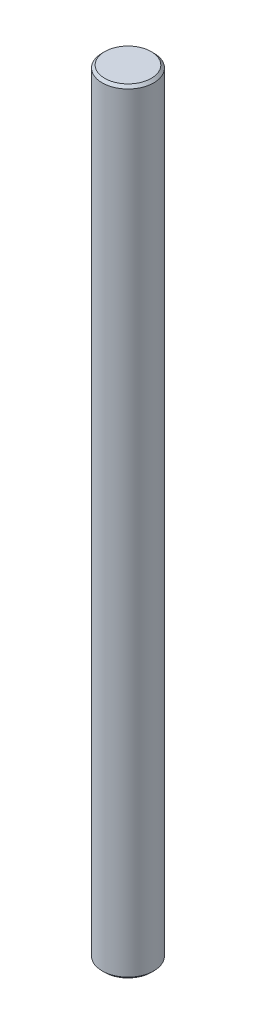
ISO-10303-21;
HEADER;
FILE_DESCRIPTION(('STEP AP214'),'2;1');
FILE_NAME('part.step','',(''),(''),'','','');
FILE_SCHEMA(('AUTOMOTIVE_DESIGN { 1 0 10303 214 1 1 1 1 }'));
ENDSEC;
DATA;
#1=APPLICATION_CONTEXT('core data for automotive mechanical design processes');
#2=APPLICATION_PROTOCOL_DEFINITION('international standard','automotive_design',2000,#1);
#3=PRODUCT_CONTEXT('',#1,'mechanical');
#4=PRODUCT('Part','Part','',(#3));
#5=PRODUCT_RELATED_PRODUCT_CATEGORY('part','',(#4));
#6=PRODUCT_DEFINITION_FORMATION('','',#4);
#7=PRODUCT_DEFINITION_CONTEXT('part definition',#1,'design');
#8=PRODUCT_DEFINITION('design','',#6,#7);
#9=PRODUCT_DEFINITION_SHAPE('','',#8);
#10=(LENGTH_UNIT() NAMED_UNIT(*) SI_UNIT(.MILLI.,.METRE.));
#11=(NAMED_UNIT(*) PLANE_ANGLE_UNIT() SI_UNIT($,.RADIAN.));
#12=(NAMED_UNIT(*) SI_UNIT($,.STERADIAN.) SOLID_ANGLE_UNIT());
#13=UNCERTAINTY_MEASURE_WITH_UNIT(LENGTH_MEASURE(1.E-05),#10,'distance_accuracy_value','');
#14=(GEOMETRIC_REPRESENTATION_CONTEXT(3) GLOBAL_UNCERTAINTY_ASSIGNED_CONTEXT((#13)) GLOBAL_UNIT_ASSIGNED_CONTEXT((#10,
#11,#12)) REPRESENTATION_CONTEXT('',''));
#15=CARTESIAN_POINT('',(0.,0.,0.));
#16=DIRECTION('',(0.,0.,1.));
#17=DIRECTION('',(1.,0.,0.));
#18=AXIS2_PLACEMENT_3D('',#15,#16,#17);
#19=CARTESIAN_POINT('',(0.,37.5,0.));
#20=DIRECTION('',(0.,-1.,0.));
#21=DIRECTION('',(0.,0.,-1.));
#22=AXIS2_PLACEMENT_3D('',#19,#20,#21);
#23=CYLINDRICAL_SURFACE('',#22,2.5);
#24=CARTESIAN_POINT('',(0.,-37.25,0.));
#25=DIRECTION('',(0.,1.,0.));
#26=DIRECTION('',(0.,0.,1.));
#27=AXIS2_PLACEMENT_3D('',#24,#25,#26);
#28=CIRCLE('',#27,2.5);
#29=CARTESIAN_POINT('',(0.,-37.25,2.5));
#30=VERTEX_POINT('',#29);
#31=EDGE_CURVE('E49',#30,#30,#28,.T.);
#32=ORIENTED_EDGE('',*,*,#31,.T.);
#33=EDGE_LOOP('',(#32));
#34=FACE_BOUND('',#33,.T.);
#35=CARTESIAN_POINT('',(0.,37.25,0.));
#36=DIRECTION('',(0.,1.,0.));
#37=DIRECTION('',(0.,0.,1.));
#38=AXIS2_PLACEMENT_3D('',#35,#36,#37);
#39=CIRCLE('',#38,2.5);
#40=CARTESIAN_POINT('',(0.,37.25,2.5));
#41=VERTEX_POINT('',#40);
#42=EDGE_CURVE('E53',#41,#41,#39,.F.);
#43=ORIENTED_EDGE('',*,*,#42,.T.);
#44=EDGE_LOOP('',(#43));
#45=FACE_BOUND('',#44,.T.);
#46=ADVANCED_FACE('F37',(#34,#45),#23,.T.);
#47=CARTESIAN_POINT('',(0.,37.5,0.));
#48=DIRECTION('',(0.,1.,0.));
#49=DIRECTION('',(0.,0.,1.));
#50=AXIS2_PLACEMENT_3D('',#47,#48,#49);
#51=PLANE('',#50);
#52=CARTESIAN_POINT('',(0.,37.5,0.));
#53=DIRECTION('',(0.,1.,0.));
#54=DIRECTION('',(0.,0.,1.));
#55=AXIS2_PLACEMENT_3D('',#52,#53,#54);
#56=CIRCLE('',#55,2.25000000000001);
#57=CARTESIAN_POINT('',(0.,37.5,2.25000000000001));
#58=VERTEX_POINT('',#57);
#59=EDGE_CURVE('E10',#58,#58,#56,.T.);
#60=ORIENTED_EDGE('',*,*,#59,.T.);
#61=EDGE_LOOP('',(#60));
#62=FACE_BOUND('',#61,.T.);
#63=ADVANCED_FACE('F69',(#62),#51,.T.);
#64=CARTESIAN_POINT('',(0.,-37.5,0.));
#65=DIRECTION('',(0.,1.,0.));
#66=DIRECTION('',(0.,0.,1.));
#67=AXIS2_PLACEMENT_3D('',#64,#65,#66);
#68=PLANE('',#67);
#69=CARTESIAN_POINT('',(0.,-37.5,0.));
#70=DIRECTION('',(0.,1.,0.));
#71=DIRECTION('',(0.,0.,1.));
#72=AXIS2_PLACEMENT_3D('',#69,#70,#71);
#73=CIRCLE('',#72,2.24999999999999);
#74=CARTESIAN_POINT('',(0.,-37.5,2.24999999999999));
#75=VERTEX_POINT('',#74);
#76=EDGE_CURVE('E45',#75,#75,#73,.F.);
#77=ORIENTED_EDGE('',*,*,#76,.T.);
#78=EDGE_LOOP('',(#77));
#79=FACE_BOUND('',#78,.T.);
#80=ADVANCED_FACE('F66',(#79),#68,.F.);
#81=CARTESIAN_POINT('',(0.,-37.25,0.));
#82=DIRECTION('',(0.,1.,0.));
#83=DIRECTION('',(0.,0.,1.));
#84=AXIS2_PLACEMENT_3D('',#81,#82,#83);
#85=CONICAL_SURFACE('',#84,2.5,0.785398163397443);
#86=ORIENTED_EDGE('',*,*,#76,.F.);
#87=EDGE_LOOP('',(#86));
#88=FACE_BOUND('',#87,.T.);
#89=ORIENTED_EDGE('',*,*,#31,.F.);
#90=EDGE_LOOP('',(#89));
#91=FACE_BOUND('',#90,.T.);
#92=ADVANCED_FACE('F62',(#88,#91),#85,.T.);
#93=CARTESIAN_POINT('',(0.,37.5,0.));
#94=DIRECTION('',(0.,-1.,0.));
#95=DIRECTION('',(0.,0.,-1.));
#96=AXIS2_PLACEMENT_3D('',#93,#94,#95);
#97=CONICAL_SURFACE('',#96,2.25000000000001,0.785398163397443);
#98=ORIENTED_EDGE('',*,*,#42,.F.);
#99=EDGE_LOOP('',(#98));
#100=FACE_BOUND('',#99,.T.);
#101=ORIENTED_EDGE('',*,*,#59,.F.);
#102=EDGE_LOOP('',(#101));
#103=FACE_BOUND('',#102,.T.);
#104=ADVANCED_FACE('F40',(#100,#103),#97,.T.);
#105=CLOSED_SHELL('',(#46,#63,#80,#92,#104));
#106=MANIFOLD_SOLID_BREP('B2',#105);
#107=ADVANCED_BREP_SHAPE_REPRESENTATION('',(#18,#106),#14);
#108=SHAPE_DEFINITION_REPRESENTATION(#9,#107);
ENDSEC;
END-ISO-10303-21;
